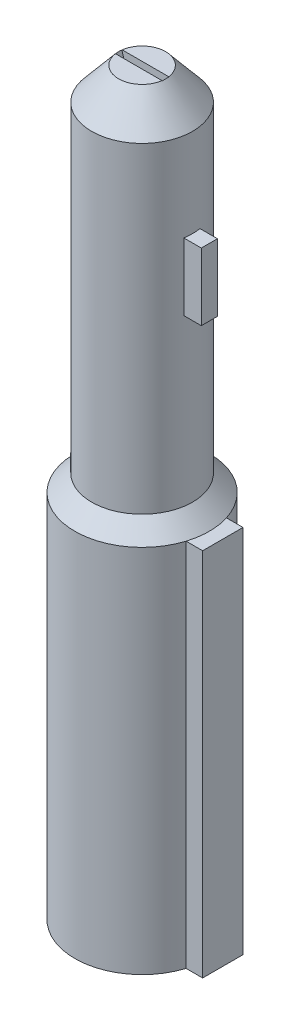
ISO-10303-21;
HEADER;
FILE_DESCRIPTION(('STEP AP214'),'2;1');
FILE_NAME('part.step','',(''),(''),'','','');
FILE_SCHEMA(('AUTOMOTIVE_DESIGN { 1 0 10303 214 1 1 1 1 }'));
ENDSEC;
DATA;
#1=APPLICATION_CONTEXT('core data for automotive mechanical design processes');
#2=APPLICATION_PROTOCOL_DEFINITION('international standard','automotive_design',2000,#1);
#3=PRODUCT_CONTEXT('',#1,'mechanical');
#4=PRODUCT('Part','Part','',(#3));
#5=PRODUCT_RELATED_PRODUCT_CATEGORY('part','',(#4));
#6=PRODUCT_DEFINITION_FORMATION('','',#4);
#7=PRODUCT_DEFINITION_CONTEXT('part definition',#1,'design');
#8=PRODUCT_DEFINITION('design','',#6,#7);
#9=PRODUCT_DEFINITION_SHAPE('','',#8);
#10=(LENGTH_UNIT() NAMED_UNIT(*) SI_UNIT(.MILLI.,.METRE.));
#11=(NAMED_UNIT(*) PLANE_ANGLE_UNIT() SI_UNIT($,.RADIAN.));
#12=(NAMED_UNIT(*) SI_UNIT($,.STERADIAN.) SOLID_ANGLE_UNIT());
#13=UNCERTAINTY_MEASURE_WITH_UNIT(LENGTH_MEASURE(1.E-05),#10,'distance_accuracy_value','');
#14=(GEOMETRIC_REPRESENTATION_CONTEXT(3) GLOBAL_UNCERTAINTY_ASSIGNED_CONTEXT((#13)) GLOBAL_UNIT_ASSIGNED_CONTEXT((#10,
#11,#12)) REPRESENTATION_CONTEXT('',''));
#15=CARTESIAN_POINT('',(0.,0.,0.));
#16=DIRECTION('',(0.,0.,1.));
#17=DIRECTION('',(1.,0.,0.));
#18=AXIS2_PLACEMENT_3D('',#15,#16,#17);
#19=CARTESIAN_POINT('',(0.,100.,0.5));
#20=DIRECTION('',(0.,0.,-1.));
#21=DIRECTION('',(-1.,0.,0.));
#22=AXIS2_PLACEMENT_3D('',#19,#20,#21);
#23=PLANE('',#22);
#24=DIRECTION('',(-1.,0.,0.));
#25=VECTOR('',#24,1.);
#26=CARTESIAN_POINT('',(0.,110.,0.5));
#27=LINE('',#26,#25);
#28=CARTESIAN_POINT('',(3.46410161513776,110.,0.500000000000001));
#29=VERTEX_POINT('',#28);
#30=CARTESIAN_POINT('',(-3.46410161513776,110.,0.5));
#31=VERTEX_POINT('',#30);
#32=EDGE_CURVE('E229',#29,#31,#27,.T.);
#33=ORIENTED_EDGE('',*,*,#32,.F.);
#34=CARTESIAN_POINT('',(3.49137837834326,109.967823669933,0.500000000000001));
#35=CARTESIAN_POINT('',(3.48683246122423,109.973186569703,0.500000000000001));
#36=CARTESIAN_POINT('',(3.48228643906427,109.978549380427,0.500000000000001));
#37=CARTESIAN_POINT('',(3.47319418466243,109.989274823783,0.500000000000001));
#38=CARTESIAN_POINT('',(3.46864795242057,109.994637456414,0.500000000000001));
#39=CARTESIAN_POINT('',(3.46410161513776,110.,0.500000000000001));
#40=B_SPLINE_CURVE_WITH_KNOTS('',3,(#34,#35,#36,#37,#38,#39),.UNSPECIFIED.,.F.,.F.,(4,2,4),(0.,
0.021091100185872,0.0421822003717995),.UNSPECIFIED.);
#41=CARTESIAN_POINT('',(3.49137837834326,109.967823669933,0.500000000000001));
#42=VERTEX_POINT('',#41);
#43=EDGE_CURVE('E388',#42,#29,#40,.T.);
#44=ORIENTED_EDGE('',*,*,#43,.F.);
#45=DIRECTION('',(0.258819045102518,0.965925826289069,0.));
#46=VECTOR('',#45,1.);
#47=CARTESIAN_POINT('',(3.5,110.,0.500000000000001));
#48=LINE('',#47,#46);
#49=CARTESIAN_POINT('',(3.17037086855465,108.769807333791,0.500000000000001));
#50=VERTEX_POINT('',#49);
#51=EDGE_CURVE('E396',#42,#50,#48,.F.);
#52=ORIENTED_EDGE('',*,*,#51,.T.);
#53=CARTESIAN_POINT('',(8.,107.475712108279,0.500000000000001));
#54=DIRECTION('',(0.,0.,-1.));
#55=DIRECTION('',(-1.,0.,0.));
#56=AXIS2_PLACEMENT_3D('',#53,#54,#55);
#57=CIRCLE('',#56,5.);
#58=CARTESIAN_POINT('',(3.,107.475712108279,0.500000000000001));
#59=VERTEX_POINT('',#58);
#60=EDGE_CURVE('E11',#50,#59,#57,.F.);
#61=ORIENTED_EDGE('',*,*,#60,.T.);
#62=DIRECTION('',(0.,1.,0.));
#63=VECTOR('',#62,1.);
#64=CARTESIAN_POINT('',(3.,100.,0.500000000000001));
#65=LINE('',#64,#63);
#66=CARTESIAN_POINT('',(3.,95.,0.500000000000001));
#67=VERTEX_POINT('',#66);
#68=EDGE_CURVE('E232',#67,#59,#65,.T.);
#69=ORIENTED_EDGE('',*,*,#68,.F.);
#70=DIRECTION('',(1.,0.,0.));
#71=VECTOR('',#70,1.);
#72=CARTESIAN_POINT('',(3.,95.,0.500000000000001));
#73=LINE('',#72,#71);
#74=CARTESIAN_POINT('',(-3.,95.,0.5));
#75=VERTEX_POINT('',#74);
#76=EDGE_CURVE('E214',#75,#67,#73,.T.);
#77=ORIENTED_EDGE('',*,*,#76,.F.);
#78=DIRECTION('',(0.,1.,0.));
#79=VECTOR('',#78,1.);
#80=CARTESIAN_POINT('',(-3.,100.,0.5));
#81=LINE('',#80,#79);
#82=CARTESIAN_POINT('',(-3.,107.475712108279,0.5));
#83=VERTEX_POINT('',#82);
#84=EDGE_CURVE('E236',#75,#83,#81,.T.);
#85=ORIENTED_EDGE('',*,*,#84,.T.);
#86=CARTESIAN_POINT('',(-8.,107.475712108279,0.499999999999999));
#87=DIRECTION('',(0.,0.,-1.));
#88=DIRECTION('',(-1.,0.,0.));
#89=AXIS2_PLACEMENT_3D('',#86,#87,#88);
#90=CIRCLE('',#89,5.);
#91=CARTESIAN_POINT('',(-3.17037086855465,108.769807333791,0.5));
#92=VERTEX_POINT('',#91);
#93=EDGE_CURVE('E424',#83,#92,#90,.F.);
#94=ORIENTED_EDGE('',*,*,#93,.T.);
#95=DIRECTION('',(-0.258819045102518,0.965925826289069,0.));
#96=VECTOR('',#95,1.);
#97=CARTESIAN_POINT('',(-3.,108.133974596216,0.5));
#98=LINE('',#97,#96);
#99=CARTESIAN_POINT('',(-3.49137837834326,109.967823669933,0.5));
#100=VERTEX_POINT('',#99);
#101=EDGE_CURVE('E405',#92,#100,#98,.T.);
#102=ORIENTED_EDGE('',*,*,#101,.T.);
#103=CARTESIAN_POINT('',(-3.46410161513776,110.,0.5));
#104=CARTESIAN_POINT('',(-3.46864795242057,109.994637456414,0.5));
#105=CARTESIAN_POINT('',(-3.47319418466243,109.989274823783,0.5));
#106=CARTESIAN_POINT('',(-3.48228643906427,109.978549380427,0.5));
#107=CARTESIAN_POINT('',(-3.48683246122424,109.973186569703,0.5));
#108=CARTESIAN_POINT('',(-3.49137837834326,109.967823669933,0.5));
#109=B_SPLINE_CURVE_WITH_KNOTS('',3,(#103,#104,#105,#106,#107,#108),.UNSPECIFIED.,.F.,.F.,(4,2,
4),(0.,0.0210911001859309,0.0421822003718051),.UNSPECIFIED.);
#110=EDGE_CURVE('E381',#31,#100,#109,.T.);
#111=ORIENTED_EDGE('',*,*,#110,.F.);
#112=EDGE_LOOP('',(#33,#44,#52,#61,#69,#77,#85,#94,#102,#111));
#113=FACE_BOUND('',#112,.T.);
#114=DIRECTION('',(0.,1.,0.));
#115=VECTOR('',#114,1.);
#116=CARTESIAN_POINT('',(-0.500000000000001,100.004046963625,0.5));
#117=LINE('',#116,#115);
#118=CARTESIAN_POINT('',(-0.500000000000001,100.004046963625,0.5));
#119=VERTEX_POINT('',#118);
#120=CARTESIAN_POINT('',(-0.500000000000001,102.504046963625,0.5));
#121=VERTEX_POINT('',#120);
#122=EDGE_CURVE('E688',#119,#121,#117,.T.);
#123=ORIENTED_EDGE('',*,*,#122,.F.);
#124=DIRECTION('',(-1.,0.,0.));
#125=VECTOR('',#124,1.);
#126=CARTESIAN_POINT('',(0.499999999999998,100.004046963625,0.500000000000001));
#127=LINE('',#126,#125);
#128=CARTESIAN_POINT('',(0.499999999999998,100.004046963625,0.500000000000001));
#129=VERTEX_POINT('',#128);
#130=EDGE_CURVE('E209',#129,#119,#127,.T.);
#131=ORIENTED_EDGE('',*,*,#130,.F.);
#132=DIRECTION('',(0.,1.,0.));
#133=VECTOR('',#132,1.);
#134=CARTESIAN_POINT('',(0.499999999999998,100.004046963625,0.500000000000001));
#135=LINE('',#134,#133);
#136=CARTESIAN_POINT('',(0.499999999999999,102.504046963625,0.500000000000001));
#137=VERTEX_POINT('',#136);
#138=EDGE_CURVE('E206',#129,#137,#135,.T.);
#139=ORIENTED_EDGE('',*,*,#138,.T.);
#140=DIRECTION('',(-1.,0.,0.));
#141=VECTOR('',#140,1.);
#142=CARTESIAN_POINT('',(0.499999999999999,102.504046963625,0.500000000000001));
#143=LINE('',#142,#141);
#144=EDGE_CURVE('E687',#137,#121,#143,.T.);
#145=ORIENTED_EDGE('',*,*,#144,.T.);
#146=EDGE_LOOP('',(#123,#131,#139,#145));
#147=FACE_BOUND('',#146,.T.);
#148=ADVANCED_FACE('F39',(#113,#147),#23,.T.);
#149=CARTESIAN_POINT('',(0.,110.,0.));
#150=DIRECTION('',(0.,1.,0.));
#151=DIRECTION('',(0.,0.,1.));
#152=AXIS2_PLACEMENT_3D('',#149,#150,#151);
#153=PLANE('',#152);
#154=CARTESIAN_POINT('',(0.,110.,0.));
#155=DIRECTION('',(0.,1.,0.));
#156=DIRECTION('',(0.,0.,1.));
#157=AXIS2_PLACEMENT_3D('',#154,#155,#156);
#158=CIRCLE('',#157,3.5);
#159=EDGE_CURVE('E299',#31,#29,#158,.T.);
#160=ORIENTED_EDGE('',*,*,#159,.T.);
#161=ORIENTED_EDGE('',*,*,#32,.T.);
#162=EDGE_LOOP('',(#160,#161));
#163=FACE_BOUND('',#162,.T.);
#164=ADVANCED_FACE('F362',(#163),#153,.T.);
#165=DIRECTION('',(-1.,0.,0.));
#166=VECTOR('',#165,1.);
#167=CARTESIAN_POINT('',(0.,110.,-0.5));
#168=LINE('',#167,#166);
#169=CARTESIAN_POINT('',(3.46410161513776,110.,-0.500000000000001));
#170=VERTEX_POINT('',#169);
#171=CARTESIAN_POINT('',(-3.46410161513776,110.,-0.5));
#172=VERTEX_POINT('',#171);
#173=EDGE_CURVE('E227',#170,#172,#168,.T.);
#174=ORIENTED_EDGE('',*,*,#173,.F.);
#175=EDGE_CURVE('E302',#170,#172,#158,.T.);
#176=ORIENTED_EDGE('',*,*,#175,.T.);
#177=EDGE_LOOP('',(#174,#176));
#178=FACE_BOUND('',#177,.T.);
#179=ADVANCED_FACE('F370',(#178),#153,.T.);
#180=CARTESIAN_POINT('',(0.,90.,0.));
#181=DIRECTION('',(0.,-1.,0.));
#182=DIRECTION('',(0.,0.,-1.));
#183=AXIS2_PLACEMENT_3D('',#180,#181,#182);
#184=CYLINDRICAL_SURFACE('',#183,7.5);
#185=CARTESIAN_POINT('',(0.,57.4999999999999,0.));
#186=DIRECTION('',(0.,-1.,0.));
#187=DIRECTION('',(0.,0.,-1.));
#188=AXIS2_PLACEMENT_3D('',#185,#186,#187);
#189=CIRCLE('',#188,7.5);
#190=CARTESIAN_POINT('',(0.,57.4999999999999,-7.5));
#191=VERTEX_POINT('',#190);
#192=EDGE_CURVE('E296',#191,#191,#189,.F.);
#193=ORIENTED_EDGE('',*,*,#192,.T.);
#194=EDGE_LOOP('',(#193));
#195=FACE_BOUND('',#194,.T.);
#196=CARTESIAN_POINT('',(0.,105.232985629623,0.));
#197=DIRECTION('',(0.,1.,0.));
#198=DIRECTION('',(0.,0.,1.));
#199=AXIS2_PLACEMENT_3D('',#196,#197,#198);
#200=CIRCLE('',#199,7.5);
#201=CARTESIAN_POINT('',(0.,105.232985629623,7.5));
#202=VERTEX_POINT('',#201);
#203=EDGE_CURVE('E303',#202,#202,#200,.F.);
#204=ORIENTED_EDGE('',*,*,#203,.T.);
#205=EDGE_LOOP('',(#204));
#206=FACE_BOUND('',#205,.T.);
#207=DIRECTION('',(0.,-1.,0.));
#208=VECTOR('',#207,1.);
#209=CARTESIAN_POINT('',(7.40337760755184,90.,1.2));
#210=LINE('',#209,#208);
#211=CARTESIAN_POINT('',(7.40337760755184,92.067071975014,1.2));
#212=VERTEX_POINT('',#211);
#213=CARTESIAN_POINT('',(7.40337760755184,82.067071975014,1.2));
#214=VERTEX_POINT('',#213);
#215=EDGE_CURVE('E315',#212,#214,#210,.T.);
#216=ORIENTED_EDGE('',*,*,#215,.F.);
#217=CARTESIAN_POINT('',(0.,92.067071975014,0.));
#218=DIRECTION('',(0.,-1.,0.));
#219=DIRECTION('',(0.,0.,-1.));
#220=AXIS2_PLACEMENT_3D('',#217,#218,#219);
#221=CIRCLE('',#220,7.5);
#222=CARTESIAN_POINT('',(7.40337760755184,92.067071975014,-1.2));
#223=VERTEX_POINT('',#222);
#224=EDGE_CURVE('E306',#223,#212,#221,.T.);
#225=ORIENTED_EDGE('',*,*,#224,.F.);
#226=DIRECTION('',(0.,-1.,0.));
#227=VECTOR('',#226,1.);
#228=CARTESIAN_POINT('',(7.40337760755184,90.,-1.2));
#229=LINE('',#228,#227);
#230=CARTESIAN_POINT('',(7.40337760755184,82.067071975014,-1.2));
#231=VERTEX_POINT('',#230);
#232=EDGE_CURVE('E309',#231,#223,#229,.F.);
#233=ORIENTED_EDGE('',*,*,#232,.F.);
#234=CARTESIAN_POINT('',(0.,82.067071975014,0.));
#235=DIRECTION('',(0.,1.,0.));
#236=DIRECTION('',(0.,0.,1.));
#237=AXIS2_PLACEMENT_3D('',#234,#235,#236);
#238=CIRCLE('',#237,7.5);
#239=EDGE_CURVE('E312',#214,#231,#238,.T.);
#240=ORIENTED_EDGE('',*,*,#239,.F.);
#241=EDGE_LOOP('',(#216,#225,#233,#240));
#242=FACE_BOUND('',#241,.T.);
#243=ADVANCED_FACE('F498',(#195,#206,#242),#184,.T.);
#244=CARTESIAN_POINT('',(0.,60.,0.));
#245=DIRECTION('',(0.,-1.,0.));
#246=DIRECTION('',(0.,0.,-1.));
#247=AXIS2_PLACEMENT_3D('',#244,#245,#246);
#248=CYLINDRICAL_SURFACE('',#247,10.);
#249=DIRECTION('',(0.,-1.,0.));
#250=VECTOR('',#249,1.);
#251=CARTESIAN_POINT('',(9.53939201416945,60.,-2.99999999999999));
#252=LINE('',#251,#250);
#253=CARTESIAN_POINT('',(9.53939201416946,0.,-2.99999999999999));
#254=VERTEX_POINT('',#253);
#255=CARTESIAN_POINT('',(9.53939201416946,55.,-2.99999999999999));
#256=VERTEX_POINT('',#255);
#257=EDGE_CURVE('E287',#254,#256,#252,.F.);
#258=ORIENTED_EDGE('',*,*,#257,.F.);
#259=CARTESIAN_POINT('',(0.,0.,0.));
#260=DIRECTION('',(0.,1.,0.));
#261=DIRECTION('',(0.,0.,1.));
#262=AXIS2_PLACEMENT_3D('',#259,#260,#261);
#263=CIRCLE('',#262,10.);
#264=CARTESIAN_POINT('',(9.53939201416946,0.,2.99999999999999));
#265=VERTEX_POINT('',#264);
#266=EDGE_CURVE('E290',#254,#265,#263,.T.);
#267=ORIENTED_EDGE('',*,*,#266,.T.);
#268=DIRECTION('',(0.,-1.,0.));
#269=VECTOR('',#268,1.);
#270=CARTESIAN_POINT('',(9.53939201416945,60.,2.99999999999999));
#271=LINE('',#270,#269);
#272=CARTESIAN_POINT('',(9.53939201416946,55.,2.99999999999999));
#273=VERTEX_POINT('',#272);
#274=EDGE_CURVE('E284',#273,#265,#271,.T.);
#275=ORIENTED_EDGE('',*,*,#274,.F.);
#276=CARTESIAN_POINT('',(0.,55.,0.));
#277=DIRECTION('',(0.,1.,0.));
#278=DIRECTION('',(0.,0.,1.));
#279=AXIS2_PLACEMENT_3D('',#276,#277,#278);
#280=CIRCLE('',#279,10.);
#281=EDGE_CURVE('E292',#273,#256,#280,.F.);
#282=ORIENTED_EDGE('',*,*,#281,.T.);
#283=EDGE_LOOP('',(#258,#267,#275,#282));
#284=FACE_BOUND('',#283,.T.);
#285=ADVANCED_FACE('F502',(#284),#248,.T.);
#286=CARTESIAN_POINT('',(0.,0.,0.));
#287=DIRECTION('',(0.,1.,0.));
#288=DIRECTION('',(0.,0.,1.));
#289=AXIS2_PLACEMENT_3D('',#286,#287,#288);
#290=PLANE('',#289);
#291=ORIENTED_EDGE('',*,*,#266,.F.);
#292=DIRECTION('',(-1.,0.,0.));
#293=VECTOR('',#292,1.);
#294=CARTESIAN_POINT('',(12.,0.,-2.99999999999999));
#295=LINE('',#294,#293);
#296=CARTESIAN_POINT('',(12.,0.,-2.99999999999999));
#297=VERTEX_POINT('',#296);
#298=EDGE_CURVE('E281',#297,#254,#295,.T.);
#299=ORIENTED_EDGE('',*,*,#298,.F.);
#300=DIRECTION('',(0.,0.,-1.));
#301=VECTOR('',#300,1.);
#302=CARTESIAN_POINT('',(12.,0.,2.99999999999999));
#303=LINE('',#302,#301);
#304=CARTESIAN_POINT('',(12.,0.,2.99999999999999));
#305=VERTEX_POINT('',#304);
#306=EDGE_CURVE('E263',#305,#297,#303,.T.);
#307=ORIENTED_EDGE('',*,*,#306,.F.);
#308=DIRECTION('',(-1.,0.,0.));
#309=VECTOR('',#308,1.);
#310=CARTESIAN_POINT('',(12.,0.,2.99999999999999));
#311=LINE('',#310,#309);
#312=EDGE_CURVE('E272',#305,#265,#311,.T.);
#313=ORIENTED_EDGE('',*,*,#312,.T.);
#314=EDGE_LOOP('',(#291,#299,#307,#313));
#315=FACE_BOUND('',#314,.T.);
#316=ADVANCED_FACE('F504',(#315),#290,.F.);
#317=CARTESIAN_POINT('',(0.,60.,0.));
#318=DIRECTION('',(0.,-1.,0.));
#319=DIRECTION('',(0.,0.,-1.));
#320=AXIS2_PLACEMENT_3D('',#317,#318,#319);
#321=CONICAL_SURFACE('',#320,4.99999999999991,0.785398163397453);
#322=EDGE_CURVE('E293',#256,#273,#280,.F.);
#323=ORIENTED_EDGE('',*,*,#322,.F.);
#324=ORIENTED_EDGE('',*,*,#281,.F.);
#325=EDGE_LOOP('',(#323,#324));
#326=FACE_BOUND('',#325,.T.);
#327=ORIENTED_EDGE('',*,*,#192,.F.);
#328=EDGE_LOOP('',(#327));
#329=FACE_BOUND('',#328,.T.);
#330=ADVANCED_FACE('F507',(#326,#329),#321,.T.);
#331=CARTESIAN_POINT('',(0.,110.,0.));
#332=DIRECTION('',(0.,-1.,0.));
#333=DIRECTION('',(0.,0.,-1.));
#334=AXIS2_PLACEMENT_3D('',#331,#332,#333);
#335=CONICAL_SURFACE('',#334,3.5,0.698131700797733);
#336=CARTESIAN_POINT('',(3.49137837834326,109.967823669933,-0.500000000000001));
#337=CARTESIAN_POINT('',(3.49352615078397,109.975839265805,-0.437583459815793));
#338=CARTESIAN_POINT('',(3.49528054508339,109.982386754467,-0.374977259883958));
#339=CARTESIAN_POINT('',(3.49798446691573,109.992477928125,-0.249493557230254));
#340=CARTESIAN_POINT('',(3.4989338299808,109.996020999319,-0.186616001706416));
#341=CARTESIAN_POINT('',(3.50053861324937,110.002010132012,0.00134459549703804));
#342=CARTESIAN_POINT('',(3.49998114779404,109.99992964261,0.126630342005029));
#343=CARTESIAN_POINT('',(3.49709544322194,109.989160046531,0.292932017978561));
#344=CARTESIAN_POINT('',(3.49619721859331,109.98580782658,0.334388051507945));
#345=CARTESIAN_POINT('',(3.49404978394255,109.977793491358,0.417256372484079));
#346=CARTESIAN_POINT('',(3.49279980668394,109.97312851272,0.458668363422692));
#347=CARTESIAN_POINT('',(3.49137837834326,109.967823669933,0.500000000000001));
#348=B_SPLINE_CURVE_WITH_KNOTS('',3,(#336,#337,#338,#339,#340,#341,#342,#343,#344,#345,#346,
#347),.UNSPECIFIED.,.F.,.F.,(4,2,2,2,2,4),(0.,0.188852376378261,0.377743325996049,
0.752888689330694,0.877678096296702,1.0027418299652),.UNSPECIFIED.);
#349=CARTESIAN_POINT('',(3.49137837834326,109.967823669933,-0.500000000000001));
#350=VERTEX_POINT('',#349);
#351=EDGE_CURVE('E397',#350,#42,#348,.T.);
#352=ORIENTED_EDGE('',*,*,#351,.T.);
#353=ORIENTED_EDGE('',*,*,#43,.T.);
#354=ORIENTED_EDGE('',*,*,#159,.F.);
#355=ORIENTED_EDGE('',*,*,#110,.T.);
#356=CARTESIAN_POINT('',(-3.49137837834326,109.967823669933,0.5));
#357=CARTESIAN_POINT('',(-3.49352623693287,109.975839587317,0.437580959441289));
#358=CARTESIAN_POINT('',(-3.49528068566379,109.98238727912,0.374972244616176));
#359=CARTESIAN_POINT('',(-3.49798465121125,109.992478615925,0.249483495574481));
#360=CARTESIAN_POINT('',(-3.49893400352847,109.996021647008,0.186603408547098));
#361=CARTESIAN_POINT('',(-3.5005386543643,110.002010285455,-0.00136471168228717));
#362=CARTESIAN_POINT('',(-3.4999809695451,109.999928977375,-0.126655450001616));
#363=CARTESIAN_POINT('',(-3.4970949234612,109.989158106757,-0.292957008547984));
#364=CARTESIAN_POINT('',(-3.49619674333257,109.985806052883,-0.334408036598399));
#365=CARTESIAN_POINT('',(-3.49404948272646,109.977792367204,-0.417266351937472));
#366=CARTESIAN_POINT('',(-3.4927996352916,109.973127873075,-0.458673342814029));
#367=CARTESIAN_POINT('',(-3.49137837834326,109.967823669933,-0.5));
#368=B_SPLINE_CURVE_WITH_KNOTS('',3,(#356,#357,#358,#359,#360,#361,#362,#363,#364,#365,#366,
#367),.UNSPECIFIED.,.F.,.F.,(4,2,2,2,2,4),(0.,0.188859937658346,0.377758454362256,
0.752918736404839,0.877693143331638,1.00274181077412),.UNSPECIFIED.);
#369=CARTESIAN_POINT('',(-3.49137837834326,109.967823669933,-0.5));
#370=VERTEX_POINT('',#369);
#371=EDGE_CURVE('E318',#100,#370,#368,.T.);
#372=ORIENTED_EDGE('',*,*,#371,.T.);
#373=CARTESIAN_POINT('',(-3.49137837834326,109.967823669933,-0.5));
#374=CARTESIAN_POINT('',(-3.48683246122423,109.973186569703,-0.5));
#375=CARTESIAN_POINT('',(-3.48228643906427,109.978549380427,-0.5));
#376=CARTESIAN_POINT('',(-3.47319418466243,109.989274823783,-0.5));
#377=CARTESIAN_POINT('',(-3.46864795242057,109.994637456414,-0.5));
#378=CARTESIAN_POINT('',(-3.46410161513776,110.,-0.5));
#379=B_SPLINE_CURVE_WITH_KNOTS('',3,(#373,#374,#375,#376,#377,#378),.UNSPECIFIED.,.F.,.F.,(4,2,
4),(0.,0.021091100185872,0.0421822003717993),.UNSPECIFIED.);
#380=EDGE_CURVE('E327',#370,#172,#379,.T.);
#381=ORIENTED_EDGE('',*,*,#380,.T.);
#382=ORIENTED_EDGE('',*,*,#175,.F.);
#383=CARTESIAN_POINT('',(3.46410161513776,110.,-0.500000000000001));
#384=CARTESIAN_POINT('',(3.46864795242057,109.994637456414,-0.500000000000001));
#385=CARTESIAN_POINT('',(3.47319418466243,109.989274823783,-0.500000000000001));
#386=CARTESIAN_POINT('',(3.48228643906427,109.978549380427,-0.500000000000001));
#387=CARTESIAN_POINT('',(3.48683246122423,109.973186569703,-0.500000000000001));
#388=CARTESIAN_POINT('',(3.49137837834326,109.967823669933,-0.500000000000001));
#389=B_SPLINE_CURVE_WITH_KNOTS('',3,(#383,#384,#385,#386,#387,#388),.UNSPECIFIED.,.F.,.F.,(4,2,
4),(0.,0.0210911001859307,0.0421822003718049),.UNSPECIFIED.);
#390=EDGE_CURVE('E446',#170,#350,#389,.T.);
#391=ORIENTED_EDGE('',*,*,#390,.T.);
#392=EDGE_LOOP('',(#352,#353,#354,#355,#372,#381,#382,#391));
#393=FACE_BOUND('',#392,.T.);
#394=ORIENTED_EDGE('',*,*,#203,.F.);
#395=EDGE_LOOP('',(#394));
#396=FACE_BOUND('',#395,.T.);
#397=ADVANCED_FACE('F335',(#393,#396),#335,.T.);
#398=CARTESIAN_POINT('',(12.,55.,-2.99999999999999));
#399=DIRECTION('',(0.,0.,1.));
#400=DIRECTION('',(0.,-1.,0.));
#401=AXIS2_PLACEMENT_3D('',#398,#399,#400);
#402=PLANE('',#401);
#403=ORIENTED_EDGE('',*,*,#298,.T.);
#404=ORIENTED_EDGE('',*,*,#257,.T.);
#405=DIRECTION('',(-1.,0.,0.));
#406=VECTOR('',#405,1.);
#407=CARTESIAN_POINT('',(12.,55.,-2.99999999999999));
#408=LINE('',#407,#406);
#409=CARTESIAN_POINT('',(12.,55.,-2.99999999999999));
#410=VERTEX_POINT('',#409);
#411=EDGE_CURVE('E278',#410,#256,#408,.T.);
#412=ORIENTED_EDGE('',*,*,#411,.F.);
#413=DIRECTION('',(0.,1.,0.));
#414=VECTOR('',#413,1.);
#415=CARTESIAN_POINT('',(12.,55.,-2.99999999999999));
#416=LINE('',#415,#414);
#417=EDGE_CURVE('E266',#297,#410,#416,.T.);
#418=ORIENTED_EDGE('',*,*,#417,.F.);
#419=EDGE_LOOP('',(#403,#404,#412,#418));
#420=FACE_BOUND('',#419,.T.);
#421=ADVANCED_FACE('F489',(#420),#402,.F.);
#422=CARTESIAN_POINT('',(12.,55.,2.99999999999999));
#423=DIRECTION('',(0.,0.,-1.));
#424=DIRECTION('',(0.,1.,0.));
#425=AXIS2_PLACEMENT_3D('',#422,#423,#424);
#426=PLANE('',#425);
#427=DIRECTION('',(-1.,0.,0.));
#428=VECTOR('',#427,1.);
#429=CARTESIAN_POINT('',(12.,55.,2.99999999999999));
#430=LINE('',#429,#428);
#431=CARTESIAN_POINT('',(12.,55.,2.99999999999999));
#432=VERTEX_POINT('',#431);
#433=EDGE_CURVE('E275',#432,#273,#430,.T.);
#434=ORIENTED_EDGE('',*,*,#433,.T.);
#435=ORIENTED_EDGE('',*,*,#274,.T.);
#436=ORIENTED_EDGE('',*,*,#312,.F.);
#437=DIRECTION('',(0.,-1.,0.));
#438=VECTOR('',#437,1.);
#439=CARTESIAN_POINT('',(12.,55.,2.99999999999999));
#440=LINE('',#439,#438);
#441=EDGE_CURVE('E270',#432,#305,#440,.T.);
#442=ORIENTED_EDGE('',*,*,#441,.F.);
#443=EDGE_LOOP('',(#434,#435,#436,#442));
#444=FACE_BOUND('',#443,.T.);
#445=ADVANCED_FACE('F486',(#444),#426,.F.);
#446=CARTESIAN_POINT('',(12.,55.,2.99999999999999));
#447=DIRECTION('',(0.,-1.,0.));
#448=DIRECTION('',(0.,0.,-1.));
#449=AXIS2_PLACEMENT_3D('',#446,#447,#448);
#450=PLANE('',#449);
#451=ORIENTED_EDGE('',*,*,#322,.T.);
#452=ORIENTED_EDGE('',*,*,#433,.F.);
#453=DIRECTION('',(0.,0.,1.));
#454=VECTOR('',#453,1.);
#455=CARTESIAN_POINT('',(12.,55.,2.99999999999999));
#456=LINE('',#455,#454);
#457=EDGE_CURVE('E268',#410,#432,#456,.T.);
#458=ORIENTED_EDGE('',*,*,#457,.F.);
#459=ORIENTED_EDGE('',*,*,#411,.T.);
#460=EDGE_LOOP('',(#451,#452,#458,#459));
#461=FACE_BOUND('',#460,.T.);
#462=ADVANCED_FACE('F484',(#461),#450,.F.);
#463=CARTESIAN_POINT('',(12.,0.,0.));
#464=DIRECTION('',(-1.,0.,0.));
#465=DIRECTION('',(0.,0.,1.));
#466=AXIS2_PLACEMENT_3D('',#463,#464,#465);
#467=PLANE('',#466);
#468=ORIENTED_EDGE('',*,*,#306,.T.);
#469=ORIENTED_EDGE('',*,*,#417,.T.);
#470=ORIENTED_EDGE('',*,*,#457,.T.);
#471=ORIENTED_EDGE('',*,*,#441,.T.);
#472=EDGE_LOOP('',(#468,#469,#470,#471));
#473=FACE_BOUND('',#472,.T.);
#474=ADVANCED_FACE('F480',(#473),#467,.F.);
#475=CARTESIAN_POINT('',(10.,92.067071975014,1.2));
#476=DIRECTION('',(0.,0.,-1.));
#477=DIRECTION('',(0.,1.,0.));
#478=AXIS2_PLACEMENT_3D('',#475,#476,#477);
#479=PLANE('',#478);
#480=DIRECTION('',(-1.,0.,0.));
#481=VECTOR('',#480,1.);
#482=CARTESIAN_POINT('',(10.,92.067071975014,1.2));
#483=LINE('',#482,#481);
#484=CARTESIAN_POINT('',(10.,92.067071975014,1.2));
#485=VERTEX_POINT('',#484);
#486=EDGE_CURVE('E251',#485,#212,#483,.T.);
#487=ORIENTED_EDGE('',*,*,#486,.T.);
#488=ORIENTED_EDGE('',*,*,#215,.T.);
#489=DIRECTION('',(-1.,0.,0.));
#490=VECTOR('',#489,1.);
#491=CARTESIAN_POINT('',(10.,82.067071975014,1.2));
#492=LINE('',#491,#490);
#493=CARTESIAN_POINT('',(10.,82.067071975014,1.2));
#494=VERTEX_POINT('',#493);
#495=EDGE_CURVE('E260',#494,#214,#492,.T.);
#496=ORIENTED_EDGE('',*,*,#495,.F.);
#497=DIRECTION('',(0.,-1.,0.));
#498=VECTOR('',#497,1.);
#499=CARTESIAN_POINT('',(10.,92.067071975014,1.2));
#500=LINE('',#499,#498);
#501=EDGE_CURVE('E235',#485,#494,#500,.T.);
#502=ORIENTED_EDGE('',*,*,#501,.F.);
#503=EDGE_LOOP('',(#487,#488,#496,#502));
#504=FACE_BOUND('',#503,.T.);
#505=ADVANCED_FACE('F473',(#504),#479,.F.);
#506=CARTESIAN_POINT('',(10.,92.067071975014,-1.2));
#507=DIRECTION('',(0.,0.,1.));
#508=DIRECTION('',(0.,-1.,0.));
#509=AXIS2_PLACEMENT_3D('',#506,#507,#508);
#510=PLANE('',#509);
#511=DIRECTION('',(-1.,0.,0.));
#512=VECTOR('',#511,1.);
#513=CARTESIAN_POINT('',(10.,82.067071975014,-1.2));
#514=LINE('',#513,#512);
#515=CARTESIAN_POINT('',(10.,82.067071975014,-1.2));
#516=VERTEX_POINT('',#515);
#517=EDGE_CURVE('E257',#516,#231,#514,.T.);
#518=ORIENTED_EDGE('',*,*,#517,.T.);
#519=ORIENTED_EDGE('',*,*,#232,.T.);
#520=DIRECTION('',(-1.,0.,0.));
#521=VECTOR('',#520,1.);
#522=CARTESIAN_POINT('',(10.,92.067071975014,-1.2));
#523=LINE('',#522,#521);
#524=CARTESIAN_POINT('',(10.,92.067071975014,-1.2));
#525=VERTEX_POINT('',#524);
#526=EDGE_CURVE('E254',#525,#223,#523,.T.);
#527=ORIENTED_EDGE('',*,*,#526,.F.);
#528=DIRECTION('',(0.,1.,0.));
#529=VECTOR('',#528,1.);
#530=CARTESIAN_POINT('',(10.,92.067071975014,-1.2));
#531=LINE('',#530,#529);
#532=EDGE_CURVE('E247',#516,#525,#531,.T.);
#533=ORIENTED_EDGE('',*,*,#532,.F.);
#534=EDGE_LOOP('',(#518,#519,#527,#533));
#535=FACE_BOUND('',#534,.T.);
#536=ADVANCED_FACE('F470',(#535),#510,.F.);
#537=CARTESIAN_POINT('',(10.,82.067071975014,1.2));
#538=DIRECTION('',(0.,1.,0.));
#539=DIRECTION('',(0.,0.,1.));
#540=AXIS2_PLACEMENT_3D('',#537,#538,#539);
#541=PLANE('',#540);
#542=ORIENTED_EDGE('',*,*,#495,.T.);
#543=ORIENTED_EDGE('',*,*,#239,.T.);
#544=ORIENTED_EDGE('',*,*,#517,.F.);
#545=DIRECTION('',(0.,0.,-1.));
#546=VECTOR('',#545,1.);
#547=CARTESIAN_POINT('',(10.,82.067071975014,1.2));
#548=LINE('',#547,#546);
#549=EDGE_CURVE('E245',#494,#516,#548,.T.);
#550=ORIENTED_EDGE('',*,*,#549,.F.);
#551=EDGE_LOOP('',(#542,#543,#544,#550));
#552=FACE_BOUND('',#551,.T.);
#553=ADVANCED_FACE('F468',(#552),#541,.F.);
#554=CARTESIAN_POINT('',(10.,92.067071975014,-1.2));
#555=DIRECTION('',(0.,-1.,0.));
#556=DIRECTION('',(0.,0.,-1.));
#557=AXIS2_PLACEMENT_3D('',#554,#555,#556);
#558=PLANE('',#557);
#559=ORIENTED_EDGE('',*,*,#526,.T.);
#560=ORIENTED_EDGE('',*,*,#224,.T.);
#561=ORIENTED_EDGE('',*,*,#486,.F.);
#562=DIRECTION('',(0.,0.,1.));
#563=VECTOR('',#562,1.);
#564=CARTESIAN_POINT('',(10.,92.067071975014,-1.2));
#565=LINE('',#564,#563);
#566=EDGE_CURVE('E249',#525,#485,#565,.T.);
#567=ORIENTED_EDGE('',*,*,#566,.F.);
#568=EDGE_LOOP('',(#559,#560,#561,#567));
#569=FACE_BOUND('',#568,.T.);
#570=ADVANCED_FACE('F464',(#569),#558,.F.);
#571=CARTESIAN_POINT('',(10.,0.,0.));
#572=DIRECTION('',(1.,0.,0.));
#573=DIRECTION('',(0.,0.,-1.));
#574=AXIS2_PLACEMENT_3D('',#571,#572,#573);
#575=PLANE('',#574);
#576=ORIENTED_EDGE('',*,*,#501,.T.);
#577=ORIENTED_EDGE('',*,*,#549,.T.);
#578=ORIENTED_EDGE('',*,*,#532,.T.);
#579=ORIENTED_EDGE('',*,*,#566,.T.);
#580=EDGE_LOOP('',(#576,#577,#578,#579));
#581=FACE_BOUND('',#580,.T.);
#582=ADVANCED_FACE('F460',(#581),#575,.T.);
#583=CARTESIAN_POINT('',(3.,100.,0.));
#584=DIRECTION('',(-1.,0.,0.));
#585=DIRECTION('',(0.,0.,1.));
#586=AXIS2_PLACEMENT_3D('',#583,#584,#585);
#587=PLANE('',#586);
#588=ORIENTED_EDGE('',*,*,#68,.T.);
#589=DIRECTION('',(0.,0.,1.));
#590=VECTOR('',#589,1.);
#591=CARTESIAN_POINT('',(3.,107.475712108279,0.));
#592=LINE('',#591,#590);
#593=CARTESIAN_POINT('',(3.,107.475712108279,-0.500000000000001));
#594=VERTEX_POINT('',#593);
#595=EDGE_CURVE('E420',#59,#594,#592,.F.);
#596=ORIENTED_EDGE('',*,*,#595,.T.);
#597=DIRECTION('',(0.,1.,0.));
#598=VECTOR('',#597,1.);
#599=CARTESIAN_POINT('',(3.,100.,-0.500000000000001));
#600=LINE('',#599,#598);
#601=CARTESIAN_POINT('',(3.,95.,-0.500000000000001));
#602=VERTEX_POINT('',#601);
#603=EDGE_CURVE('E231',#602,#594,#600,.T.);
#604=ORIENTED_EDGE('',*,*,#603,.F.);
#605=DIRECTION('',(0.,0.,-1.));
#606=VECTOR('',#605,1.);
#607=CARTESIAN_POINT('',(3.,95.,-0.500000000000001));
#608=LINE('',#607,#606);
#609=EDGE_CURVE('E221',#67,#602,#608,.T.);
#610=ORIENTED_EDGE('',*,*,#609,.F.);
#611=EDGE_LOOP('',(#588,#596,#604,#610));
#612=FACE_BOUND('',#611,.T.);
#613=ADVANCED_FACE('F457',(#612),#587,.T.);
#614=CARTESIAN_POINT('',(-3.,100.,0.));
#615=DIRECTION('',(-1.,0.,0.));
#616=DIRECTION('',(0.,0.,1.));
#617=AXIS2_PLACEMENT_3D('',#614,#615,#616);
#618=PLANE('',#617);
#619=DIRECTION('',(0.,1.,0.));
#620=VECTOR('',#619,1.);
#621=CARTESIAN_POINT('',(-3.,100.,-0.5));
#622=LINE('',#621,#620);
#623=CARTESIAN_POINT('',(-3.,95.,-0.5));
#624=VERTEX_POINT('',#623);
#625=CARTESIAN_POINT('',(-3.,107.475712108279,-0.5));
#626=VERTEX_POINT('',#625);
#627=EDGE_CURVE('E239',#624,#626,#622,.T.);
#628=ORIENTED_EDGE('',*,*,#627,.T.);
#629=DIRECTION('',(0.,0.,1.));
#630=VECTOR('',#629,1.);
#631=CARTESIAN_POINT('',(-3.,107.475712108279,0.5));
#632=LINE('',#631,#630);
#633=EDGE_CURVE('E415',#626,#83,#632,.T.);
#634=ORIENTED_EDGE('',*,*,#633,.T.);
#635=ORIENTED_EDGE('',*,*,#84,.F.);
#636=DIRECTION('',(0.,0.,1.));
#637=VECTOR('',#636,1.);
#638=CARTESIAN_POINT('',(-3.,95.,0.5));
#639=LINE('',#638,#637);
#640=EDGE_CURVE('E210',#624,#75,#639,.T.);
#641=ORIENTED_EDGE('',*,*,#640,.F.);
#642=EDGE_LOOP('',(#628,#634,#635,#641));
#643=FACE_BOUND('',#642,.T.);
#644=ADVANCED_FACE('F379',(#643),#618,.F.);
#645=CARTESIAN_POINT('',(0.,100.,-0.5));
#646=DIRECTION('',(0.,0.,-1.));
#647=DIRECTION('',(-1.,0.,0.));
#648=AXIS2_PLACEMENT_3D('',#645,#646,#647);
#649=PLANE('',#648);
#650=ORIENTED_EDGE('',*,*,#173,.T.);
#651=ORIENTED_EDGE('',*,*,#380,.F.);
#652=DIRECTION('',(0.258819045102518,-0.965925826289069,0.));
#653=VECTOR('',#652,1.);
#654=CARTESIAN_POINT('',(-0.765544456622798,99.7948729810778,-0.5));
#655=LINE('',#654,#653);
#656=CARTESIAN_POINT('',(-3.17037086855465,108.769807333791,-0.5));
#657=VERTEX_POINT('',#656);
#658=EDGE_CURVE('E407',#370,#657,#655,.T.);
#659=ORIENTED_EDGE('',*,*,#658,.T.);
#660=CARTESIAN_POINT('',(-8.,107.475712108279,-0.499999999999999));
#661=DIRECTION('',(0.,0.,-1.));
#662=DIRECTION('',(-1.,0.,0.));
#663=AXIS2_PLACEMENT_3D('',#660,#661,#662);
#664=CIRCLE('',#663,5.);
#665=EDGE_CURVE('E426',#657,#626,#664,.T.);
#666=ORIENTED_EDGE('',*,*,#665,.T.);
#667=ORIENTED_EDGE('',*,*,#627,.F.);
#668=DIRECTION('',(-1.,0.,0.));
#669=VECTOR('',#668,1.);
#670=CARTESIAN_POINT('',(-3.,95.,-0.5));
#671=LINE('',#670,#669);
#672=EDGE_CURVE('E224',#602,#624,#671,.T.);
#673=ORIENTED_EDGE('',*,*,#672,.F.);
#674=ORIENTED_EDGE('',*,*,#603,.T.);
#675=CARTESIAN_POINT('',(8.,107.475712108279,-0.500000000000001));
#676=DIRECTION('',(0.,0.,-1.));
#677=DIRECTION('',(-1.,0.,0.));
#678=AXIS2_PLACEMENT_3D('',#675,#676,#677);
#679=CIRCLE('',#678,5.);
#680=CARTESIAN_POINT('',(3.17037086855465,108.769807333791,-0.500000000000001));
#681=VERTEX_POINT('',#680);
#682=EDGE_CURVE('E47',#594,#681,#679,.T.);
#683=ORIENTED_EDGE('',*,*,#682,.T.);
#684=DIRECTION('',(-0.258819045102518,-0.965925826289069,0.));
#685=VECTOR('',#684,1.);
#686=CARTESIAN_POINT('',(0.765544456622798,99.7948729810778,-0.500000000000001));
#687=LINE('',#686,#685);
#688=EDGE_CURVE('E403',#681,#350,#687,.F.);
#689=ORIENTED_EDGE('',*,*,#688,.T.);
#690=ORIENTED_EDGE('',*,*,#390,.F.);
#691=EDGE_LOOP('',(#650,#651,#659,#666,#667,#673,#674,#683,#689,#690));
#692=FACE_BOUND('',#691,.T.);
#693=ADVANCED_FACE('F427',(#692),#649,.F.);
#694=CARTESIAN_POINT('',(0.,95.,0.));
#695=DIRECTION('',(0.,-1.,0.));
#696=DIRECTION('',(0.,0.,-1.));
#697=AXIS2_PLACEMENT_3D('',#694,#695,#696);
#698=PLANE('',#697);
#699=ORIENTED_EDGE('',*,*,#640,.T.);
#700=ORIENTED_EDGE('',*,*,#76,.T.);
#701=ORIENTED_EDGE('',*,*,#609,.T.);
#702=ORIENTED_EDGE('',*,*,#672,.T.);
#703=EDGE_LOOP('',(#699,#700,#701,#702));
#704=FACE_BOUND('',#703,.T.);
#705=ADVANCED_FACE('F377',(#704),#698,.F.);
#706=CARTESIAN_POINT('',(3.5,110.,0.));
#707=DIRECTION('',(0.965925826289069,-0.258819045102518,0.));
#708=DIRECTION('',(0.,0.,1.));
#709=AXIS2_PLACEMENT_3D('',#706,#707,#708);
#710=PLANE('',#709);
#711=ORIENTED_EDGE('',*,*,#688,.F.);
#712=DIRECTION('',(0.,0.,-1.));
#713=VECTOR('',#712,1.);
#714=CARTESIAN_POINT('',(3.17037086855465,108.769807333791,0.));
#715=LINE('',#714,#713);
#716=EDGE_CURVE('E54',#681,#50,#715,.F.);
#717=ORIENTED_EDGE('',*,*,#716,.T.);
#718=ORIENTED_EDGE('',*,*,#51,.F.);
#719=ORIENTED_EDGE('',*,*,#351,.F.);
#720=EDGE_LOOP('',(#711,#717,#718,#719));
#721=FACE_BOUND('',#720,.T.);
#722=ADVANCED_FACE('F347',(#721),#710,.F.);
#723=CARTESIAN_POINT('',(-3.,108.133974596216,0.));
#724=DIRECTION('',(0.965925826289069,0.258819045102518,0.));
#725=DIRECTION('',(0.,0.,-1.));
#726=AXIS2_PLACEMENT_3D('',#723,#724,#725);
#727=PLANE('',#726);
#728=ORIENTED_EDGE('',*,*,#101,.F.);
#729=DIRECTION('',(0.,0.,1.));
#730=VECTOR('',#729,1.);
#731=CARTESIAN_POINT('',(-3.17037086855465,108.769807333791,-0.5));
#732=LINE('',#731,#730);
#733=EDGE_CURVE('E418',#92,#657,#732,.F.);
#734=ORIENTED_EDGE('',*,*,#733,.T.);
#735=ORIENTED_EDGE('',*,*,#658,.F.);
#736=ORIENTED_EDGE('',*,*,#371,.F.);
#737=EDGE_LOOP('',(#728,#734,#735,#736));
#738=FACE_BOUND('',#737,.T.);
#739=ADVANCED_FACE('F340',(#738),#727,.T.);
#740=CARTESIAN_POINT('',(0.499999999999998,100.004046963625,0.));
#741=DIRECTION('',(0.,1.,0.));
#742=DIRECTION('',(0.,0.,1.));
#743=AXIS2_PLACEMENT_3D('',#740,#741,#742);
#744=PLANE('',#743);
#745=ORIENTED_EDGE('',*,*,#130,.T.);
#746=DIRECTION('',(0.,0.,1.));
#747=VECTOR('',#746,1.);
#748=CARTESIAN_POINT('',(-0.500000000000001,100.004046963625,0.));
#749=LINE('',#748,#747);
#750=CARTESIAN_POINT('',(-0.500000000000001,100.004046963625,0.));
#751=VERTEX_POINT('',#750);
#752=EDGE_CURVE('E192',#751,#119,#749,.T.);
#753=ORIENTED_EDGE('',*,*,#752,.F.);
#754=DIRECTION('',(-1.,0.,0.));
#755=VECTOR('',#754,1.);
#756=CARTESIAN_POINT('',(0.499999999999998,100.004046963625,0.));
#757=LINE('',#756,#755);
#758=CARTESIAN_POINT('',(0.499999999999998,100.004046963625,0.));
#759=VERTEX_POINT('',#758);
#760=EDGE_CURVE('E198',#759,#751,#757,.T.);
#761=ORIENTED_EDGE('',*,*,#760,.F.);
#762=DIRECTION('',(0.,0.,1.));
#763=VECTOR('',#762,1.);
#764=CARTESIAN_POINT('',(0.499999999999998,100.004046963625,0.));
#765=LINE('',#764,#763);
#766=EDGE_CURVE('E211',#759,#129,#765,.T.);
#767=ORIENTED_EDGE('',*,*,#766,.T.);
#768=EDGE_LOOP('',(#745,#753,#761,#767));
#769=FACE_BOUND('',#768,.T.);
#770=ADVANCED_FACE('F208',(#769),#744,.F.);
#771=CARTESIAN_POINT('',(-0.500000000000001,100.004046963625,0.));
#772=DIRECTION('',(1.,0.,0.));
#773=DIRECTION('',(0.,0.,-1.));
#774=AXIS2_PLACEMENT_3D('',#771,#772,#773);
#775=PLANE('',#774);
#776=ORIENTED_EDGE('',*,*,#122,.T.);
#777=CARTESIAN_POINT('',(-0.500000000000001,101.63802155984,1.));
#778=DIRECTION('',(1.,0.,0.));
#779=DIRECTION('',(0.,0.,-1.));
#780=AXIS2_PLACEMENT_3D('',#777,#778,#779);
#781=CIRCLE('',#780,1.);
#782=CARTESIAN_POINT('',(-0.500000000000001,101.63802155984,0.));
#783=VERTEX_POINT('',#782);
#784=EDGE_CURVE('E194',#121,#783,#781,.F.);
#785=ORIENTED_EDGE('',*,*,#784,.T.);
#786=DIRECTION('',(0.,1.,0.));
#787=VECTOR('',#786,1.);
#788=CARTESIAN_POINT('',(-0.500000000000001,100.004046963625,0.));
#789=LINE('',#788,#787);
#790=EDGE_CURVE('E187',#751,#783,#789,.T.);
#791=ORIENTED_EDGE('',*,*,#790,.F.);
#792=ORIENTED_EDGE('',*,*,#752,.T.);
#793=EDGE_LOOP('',(#776,#785,#791,#792));
#794=FACE_BOUND('',#793,.T.);
#795=ADVANCED_FACE('F190',(#794),#775,.F.);
#796=CARTESIAN_POINT('',(0.499999999999998,100.004046963625,0.));
#797=DIRECTION('',(1.,0.,0.));
#798=DIRECTION('',(0.,1.,0.));
#799=AXIS2_PLACEMENT_3D('',#796,#797,#798);
#800=PLANE('',#799);
#801=DIRECTION('',(0.,1.,0.));
#802=VECTOR('',#801,1.);
#803=CARTESIAN_POINT('',(0.499999999999998,100.004046963625,0.));
#804=LINE('',#803,#802);
#805=CARTESIAN_POINT('',(0.499999999999999,101.63802155984,0.));
#806=VERTEX_POINT('',#805);
#807=EDGE_CURVE('E197',#759,#806,#804,.T.);
#808=ORIENTED_EDGE('',*,*,#807,.T.);
#809=CARTESIAN_POINT('',(0.499999999999999,101.63802155984,1.));
#810=DIRECTION('',(1.,0.,0.));
#811=DIRECTION('',(0.,1.,0.));
#812=AXIS2_PLACEMENT_3D('',#809,#810,#811);
#813=CIRCLE('',#812,1.);
#814=EDGE_CURVE('E413',#806,#137,#813,.T.);
#815=ORIENTED_EDGE('',*,*,#814,.T.);
#816=ORIENTED_EDGE('',*,*,#138,.F.);
#817=ORIENTED_EDGE('',*,*,#766,.F.);
#818=EDGE_LOOP('',(#808,#815,#816,#817));
#819=FACE_BOUND('',#818,.T.);
#820=ADVANCED_FACE('F640',(#819),#800,.T.);
#821=CARTESIAN_POINT('',(0.,0.,0.));
#822=DIRECTION('',(0.,0.,-1.));
#823=DIRECTION('',(-1.,0.,0.));
#824=AXIS2_PLACEMENT_3D('',#821,#822,#823);
#825=PLANE('',#824);
#826=ORIENTED_EDGE('',*,*,#790,.T.);
#827=DIRECTION('',(1.,0.,0.));
#828=VECTOR('',#827,1.);
#829=CARTESIAN_POINT('',(0.499999999999999,101.63802155984,0.));
#830=LINE('',#829,#828);
#831=EDGE_CURVE('E411',#783,#806,#830,.T.);
#832=ORIENTED_EDGE('',*,*,#831,.T.);
#833=ORIENTED_EDGE('',*,*,#807,.F.);
#834=ORIENTED_EDGE('',*,*,#760,.T.);
#835=EDGE_LOOP('',(#826,#832,#833,#834));
#836=FACE_BOUND('',#835,.T.);
#837=ADVANCED_FACE('F202',(#836),#825,.T.);
#838=CARTESIAN_POINT('',(0.499999999999999,101.63802155984,1.));
#839=DIRECTION('',(-1.,0.,0.));
#840=DIRECTION('',(0.,0.,1.));
#841=AXIS2_PLACEMENT_3D('',#838,#839,#840);
#842=CYLINDRICAL_SURFACE('',#841,1.);
#843=ORIENTED_EDGE('',*,*,#814,.F.);
#844=ORIENTED_EDGE('',*,*,#831,.F.);
#845=ORIENTED_EDGE('',*,*,#784,.F.);
#846=ORIENTED_EDGE('',*,*,#144,.F.);
#847=EDGE_LOOP('',(#843,#844,#845,#846));
#848=FACE_BOUND('',#847,.T.);
#849=ADVANCED_FACE('F350',(#848),#842,.T.);
#850=CARTESIAN_POINT('',(-8.,107.475712108279,0.));
#851=DIRECTION('',(0.,0.,-1.));
#852=DIRECTION('',(-1.,0.,0.));
#853=AXIS2_PLACEMENT_3D('',#850,#851,#852);
#854=CYLINDRICAL_SURFACE('',#853,5.);
#855=ORIENTED_EDGE('',*,*,#665,.F.);
#856=ORIENTED_EDGE('',*,*,#733,.F.);
#857=ORIENTED_EDGE('',*,*,#93,.F.);
#858=ORIENTED_EDGE('',*,*,#633,.F.);
#859=EDGE_LOOP('',(#855,#856,#857,#858));
#860=FACE_BOUND('',#859,.T.);
#861=ADVANCED_FACE('F352',(#860),#854,.T.);
#862=CARTESIAN_POINT('',(8.,107.475712108279,0.));
#863=DIRECTION('',(0.,0.,1.));
#864=DIRECTION('',(1.,0.,0.));
#865=AXIS2_PLACEMENT_3D('',#862,#863,#864);
#866=CYLINDRICAL_SURFACE('',#865,5.);
#867=ORIENTED_EDGE('',*,*,#60,.F.);
#868=ORIENTED_EDGE('',*,*,#716,.F.);
#869=ORIENTED_EDGE('',*,*,#682,.F.);
#870=ORIENTED_EDGE('',*,*,#595,.F.);
#871=EDGE_LOOP('',(#867,#868,#869,#870));
#872=FACE_BOUND('',#871,.T.);
#873=ADVANCED_FACE('F41',(#872),#866,.T.);
#874=CLOSED_SHELL('',(#148,#164,#179,#243,#285,#316,#330,#397,#421,#445,#462,#474,#505,#536,
#553,#570,#582,#613,#644,#693,#705,#722,#739,#770,#795,#820,#837,#849,#861,#873));
#875=MANIFOLD_SOLID_BREP('B2',#874);
#876=ADVANCED_BREP_SHAPE_REPRESENTATION('',(#18,#875),#14);
#877=SHAPE_DEFINITION_REPRESENTATION(#9,#876);
ENDSEC;
END-ISO-10303-21;
